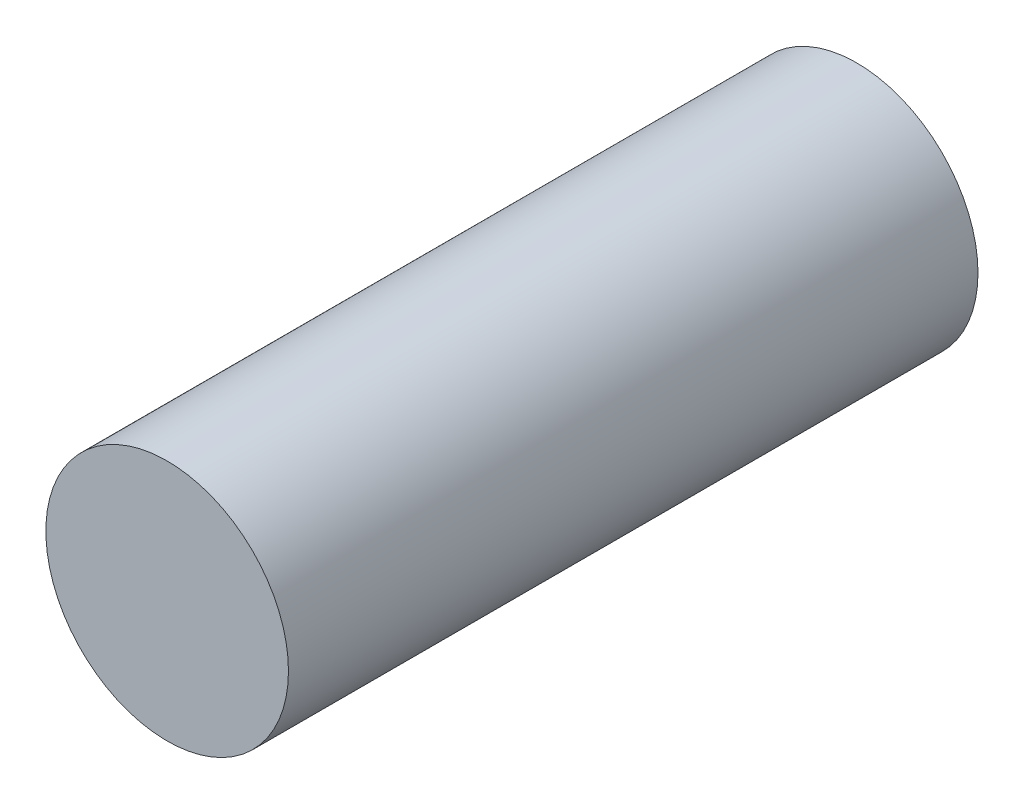
ISO-10303-21;
HEADER;
FILE_DESCRIPTION(('STEP AP214'),'2;1');
FILE_NAME('part.step','',(''),(''),'','','');
FILE_SCHEMA(('AUTOMOTIVE_DESIGN { 1 0 10303 214 1 1 1 1 }'));
ENDSEC;
DATA;
#1=APPLICATION_CONTEXT('core data for automotive mechanical design processes');
#2=APPLICATION_PROTOCOL_DEFINITION('international standard','automotive_design',2000,#1);
#3=PRODUCT_CONTEXT('',#1,'mechanical');
#4=PRODUCT('Part','Part','',(#3));
#5=PRODUCT_RELATED_PRODUCT_CATEGORY('part','',(#4));
#6=PRODUCT_DEFINITION_FORMATION('','',#4);
#7=PRODUCT_DEFINITION_CONTEXT('part definition',#1,'design');
#8=PRODUCT_DEFINITION('design','',#6,#7);
#9=PRODUCT_DEFINITION_SHAPE('','',#8);
#10=(LENGTH_UNIT() NAMED_UNIT(*) SI_UNIT(.MILLI.,.METRE.));
#11=(NAMED_UNIT(*) PLANE_ANGLE_UNIT() SI_UNIT($,.RADIAN.));
#12=(NAMED_UNIT(*) SI_UNIT($,.STERADIAN.) SOLID_ANGLE_UNIT());
#13=UNCERTAINTY_MEASURE_WITH_UNIT(LENGTH_MEASURE(1.E-05),#10,'distance_accuracy_value','');
#14=(GEOMETRIC_REPRESENTATION_CONTEXT(3) GLOBAL_UNCERTAINTY_ASSIGNED_CONTEXT((#13)) GLOBAL_UNIT_ASSIGNED_CONTEXT((#10,
#11,#12)) REPRESENTATION_CONTEXT('',''));
#15=CARTESIAN_POINT('',(0.,0.,0.));
#16=DIRECTION('',(0.,0.,1.));
#17=DIRECTION('',(1.,0.,0.));
#18=AXIS2_PLACEMENT_3D('',#15,#16,#17);
#19=CARTESIAN_POINT('',(0.,0.,54.));
#20=DIRECTION('',(0.,0.,-1.));
#21=DIRECTION('',(-1.,0.,0.));
#22=AXIS2_PLACEMENT_3D('',#19,#20,#21);
#23=CYLINDRICAL_SURFACE('',#22,9.5);
#24=CARTESIAN_POINT('',(0.,0.,54.));
#25=DIRECTION('',(0.,0.,1.));
#26=DIRECTION('',(1.,0.,0.));
#27=AXIS2_PLACEMENT_3D('',#24,#25,#26);
#28=CIRCLE('',#27,9.5);
#29=CARTESIAN_POINT('',(9.5,0.,54.));
#30=VERTEX_POINT('',#29);
#31=EDGE_CURVE('E10',#30,#30,#28,.T.);
#32=ORIENTED_EDGE('',*,*,#31,.F.);
#33=EDGE_LOOP('',(#32));
#34=FACE_BOUND('',#33,.T.);
#35=CARTESIAN_POINT('',(0.,0.,0.));
#36=DIRECTION('',(0.,0.,1.));
#37=DIRECTION('',(1.,0.,0.));
#38=AXIS2_PLACEMENT_3D('',#35,#36,#37);
#39=CIRCLE('',#38,9.5);
#40=CARTESIAN_POINT('',(9.5,0.,0.));
#41=VERTEX_POINT('',#40);
#42=EDGE_CURVE('E42',#41,#41,#39,.T.);
#43=ORIENTED_EDGE('',*,*,#42,.T.);
#44=EDGE_LOOP('',(#43));
#45=FACE_BOUND('',#44,.T.);
#46=ADVANCED_FACE('F39',(#34,#45),#23,.T.);
#47=CARTESIAN_POINT('',(0.,0.,54.));
#48=DIRECTION('',(0.,0.,1.));
#49=DIRECTION('',(1.,0.,0.));
#50=AXIS2_PLACEMENT_3D('',#47,#48,#49);
#51=PLANE('',#50);
#52=ORIENTED_EDGE('',*,*,#31,.T.);
#53=EDGE_LOOP('',(#52));
#54=FACE_BOUND('',#53,.T.);
#55=ADVANCED_FACE('F54',(#54),#51,.T.);
#56=CARTESIAN_POINT('',(0.,0.,0.));
#57=DIRECTION('',(0.,0.,1.));
#58=DIRECTION('',(1.,0.,0.));
#59=AXIS2_PLACEMENT_3D('',#56,#57,#58);
#60=PLANE('',#59);
#61=ORIENTED_EDGE('',*,*,#42,.F.);
#62=EDGE_LOOP('',(#61));
#63=FACE_BOUND('',#62,.T.);
#64=ADVANCED_FACE('F52',(#63),#60,.F.);
#65=CLOSED_SHELL('',(#46,#55,#64));
#66=MANIFOLD_SOLID_BREP('B2',#65);
#67=ADVANCED_BREP_SHAPE_REPRESENTATION('',(#18,#66),#14);
#68=SHAPE_DEFINITION_REPRESENTATION(#9,#67);
ENDSEC;
END-ISO-10303-21;
